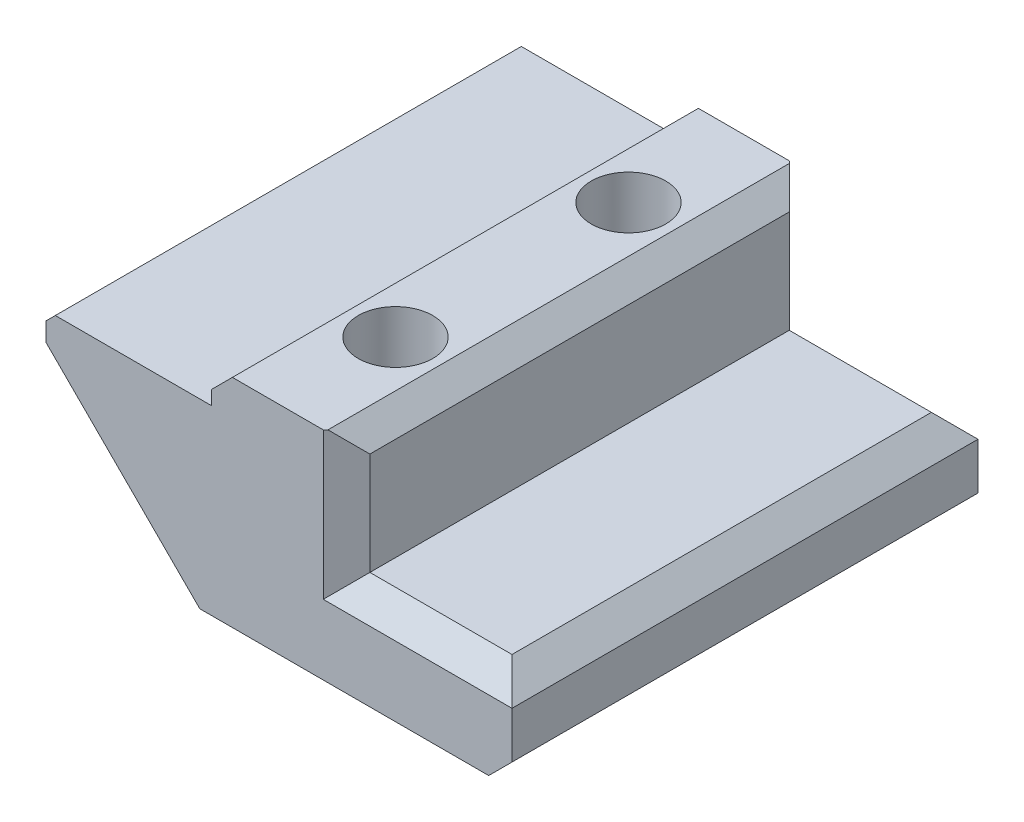
ISO-10303-21;
HEADER;
FILE_DESCRIPTION(('STEP AP214'),'2;1');
FILE_NAME('part.step','',(''),(''),'','','');
FILE_SCHEMA(('AUTOMOTIVE_DESIGN { 1 0 10303 214 1 1 1 1 }'));
ENDSEC;
DATA;
#1=APPLICATION_CONTEXT('core data for automotive mechanical design processes');
#2=APPLICATION_PROTOCOL_DEFINITION('international standard','automotive_design',2000,#1);
#3=PRODUCT_CONTEXT('',#1,'mechanical');
#4=PRODUCT('Part','Part','',(#3));
#5=PRODUCT_RELATED_PRODUCT_CATEGORY('part','',(#4));
#6=PRODUCT_DEFINITION_FORMATION('','',#4);
#7=PRODUCT_DEFINITION_CONTEXT('part definition',#1,'design');
#8=PRODUCT_DEFINITION('design','',#6,#7);
#9=PRODUCT_DEFINITION_SHAPE('','',#8);
#10=(LENGTH_UNIT() NAMED_UNIT(*) SI_UNIT(.MILLI.,.METRE.));
#11=(NAMED_UNIT(*) PLANE_ANGLE_UNIT() SI_UNIT($,.RADIAN.));
#12=(NAMED_UNIT(*) SI_UNIT($,.STERADIAN.) SOLID_ANGLE_UNIT());
#13=UNCERTAINTY_MEASURE_WITH_UNIT(LENGTH_MEASURE(1.E-05),#10,'distance_accuracy_value','');
#14=(GEOMETRIC_REPRESENTATION_CONTEXT(3) GLOBAL_UNCERTAINTY_ASSIGNED_CONTEXT((#13)) GLOBAL_UNIT_ASSIGNED_CONTEXT((#10,
#11,#12)) REPRESENTATION_CONTEXT('',''));
#15=CARTESIAN_POINT('',(0.,0.,0.));
#16=DIRECTION('',(0.,0.,1.));
#17=DIRECTION('',(1.,0.,0.));
#18=AXIS2_PLACEMENT_3D('',#15,#16,#17);
#19=CARTESIAN_POINT('',(10.,7.8,-15.));
#20=DIRECTION('',(0.,-1.,0.));
#21=DIRECTION('',(0.,0.,-1.));
#22=AXIS2_PLACEMENT_3D('',#19,#20,#21);
#23=CYLINDRICAL_SURFACE('',#22,1.6);
#24=CARTESIAN_POINT('',(10.,3.90000000000001,-15.));
#25=DIRECTION('',(0.,-1.,0.));
#26=DIRECTION('',(0.,0.,-1.));
#27=AXIS2_PLACEMENT_3D('',#24,#25,#26);
#28=CIRCLE('',#27,1.6);
#29=CARTESIAN_POINT('',(10.,3.90000000000001,-16.6));
#30=VERTEX_POINT('',#29);
#31=EDGE_CURVE('E198',#30,#30,#28,.T.);
#32=ORIENTED_EDGE('',*,*,#31,.T.);
#33=EDGE_LOOP('',(#32));
#34=FACE_BOUND('',#33,.T.);
#35=CARTESIAN_POINT('',(10.,9.3,-15.));
#36=DIRECTION('',(0.,1.,0.));
#37=DIRECTION('',(0.,0.,1.));
#38=AXIS2_PLACEMENT_3D('',#35,#36,#37);
#39=CIRCLE('',#38,1.6);
#40=CARTESIAN_POINT('',(10.,9.3,-13.4));
#41=VERTEX_POINT('',#40);
#42=EDGE_CURVE('E170',#41,#41,#39,.T.);
#43=ORIENTED_EDGE('',*,*,#42,.T.);
#44=EDGE_LOOP('',(#43));
#45=FACE_BOUND('',#44,.T.);
#46=ADVANCED_FACE('F39',(#34,#45),#23,.F.);
#47=CARTESIAN_POINT('',(10.,7.8,-5.));
#48=DIRECTION('',(0.,-1.,0.));
#49=DIRECTION('',(0.,0.,-1.));
#50=AXIS2_PLACEMENT_3D('',#47,#48,#49);
#51=CYLINDRICAL_SURFACE('',#50,1.6);
#52=CARTESIAN_POINT('',(10.,3.90000000000001,-5.));
#53=DIRECTION('',(0.,-1.,0.));
#54=DIRECTION('',(0.,0.,-1.));
#55=AXIS2_PLACEMENT_3D('',#52,#53,#54);
#56=CIRCLE('',#55,1.6);
#57=CARTESIAN_POINT('',(10.,3.90000000000001,-6.6));
#58=VERTEX_POINT('',#57);
#59=EDGE_CURVE('E201',#58,#58,#56,.T.);
#60=ORIENTED_EDGE('',*,*,#59,.T.);
#61=EDGE_LOOP('',(#60));
#62=FACE_BOUND('',#61,.T.);
#63=CARTESIAN_POINT('',(10.,9.3,-5.));
#64=DIRECTION('',(0.,1.,0.));
#65=DIRECTION('',(0.,0.,1.));
#66=AXIS2_PLACEMENT_3D('',#63,#64,#65);
#67=CIRCLE('',#66,1.6);
#68=CARTESIAN_POINT('',(10.,9.3,-3.4));
#69=VERTEX_POINT('',#68);
#70=EDGE_CURVE('E175',#69,#69,#67,.T.);
#71=ORIENTED_EDGE('',*,*,#70,.T.);
#72=EDGE_LOOP('',(#71));
#73=FACE_BOUND('',#72,.T.);
#74=ADVANCED_FACE('F342',(#62,#73),#51,.F.);
#75=CARTESIAN_POINT('',(0.,4.,0.));
#76=DIRECTION('',(0.,-1.,0.));
#77=DIRECTION('',(0.,0.,-1.));
#78=AXIS2_PLACEMENT_3D('',#75,#76,#77);
#79=PLANE('',#78);
#80=DIRECTION('',(0.,0.,-1.));
#81=VECTOR('',#80,1.);
#82=CARTESIAN_POINT('',(12.9,4.,-20.));
#83=LINE('',#82,#81);
#84=CARTESIAN_POINT('',(12.9,4.,-1.));
#85=VERTEX_POINT('',#84);
#86=CARTESIAN_POINT('',(12.9,4.,-19.));
#87=VERTEX_POINT('',#86);
#88=EDGE_CURVE('E154',#85,#87,#83,.T.);
#89=ORIENTED_EDGE('',*,*,#88,.F.);
#90=DIRECTION('',(1.,0.,0.));
#91=VECTOR('',#90,1.);
#92=CARTESIAN_POINT('',(0.,4.,-1.));
#93=LINE('',#92,#91);
#94=CARTESIAN_POINT('',(19.,4.,-1.));
#95=VERTEX_POINT('',#94);
#96=EDGE_CURVE('E249',#85,#95,#93,.T.);
#97=ORIENTED_EDGE('',*,*,#96,.T.);
#98=DIRECTION('',(0.,0.,-1.));
#99=VECTOR('',#98,1.);
#100=CARTESIAN_POINT('',(19.,4.,0.));
#101=LINE('',#100,#99);
#102=CARTESIAN_POINT('',(19.,4.,-19.));
#103=VERTEX_POINT('',#102);
#104=EDGE_CURVE('E245',#95,#103,#101,.T.);
#105=ORIENTED_EDGE('',*,*,#104,.T.);
#106=DIRECTION('',(-1.,0.,0.));
#107=VECTOR('',#106,1.);
#108=CARTESIAN_POINT('',(0.,4.,-19.));
#109=LINE('',#108,#107);
#110=EDGE_CURVE('E247',#103,#87,#109,.T.);
#111=ORIENTED_EDGE('',*,*,#110,.T.);
#112=EDGE_LOOP('',(#89,#97,#105,#111));
#113=FACE_BOUND('',#112,.T.);
#114=ADVANCED_FACE('F313',(#113),#79,.F.);
#115=CARTESIAN_POINT('',(0.,4.,0.));
#116=DIRECTION('',(1.,0.,0.));
#117=DIRECTION('',(0.,0.,-1.));
#118=AXIS2_PLACEMENT_3D('',#115,#116,#117);
#119=PLANE('',#118);
#120=DIRECTION('',(0.,-1.,0.));
#121=VECTOR('',#120,1.);
#122=CARTESIAN_POINT('',(0.,4.,0.));
#123=LINE('',#122,#121);
#124=CARTESIAN_POINT('',(0.,7.4,0.));
#125=VERTEX_POINT('',#124);
#126=CARTESIAN_POINT('',(0.,6.6,0.));
#127=VERTEX_POINT('',#126);
#128=EDGE_CURVE('E196',#125,#127,#123,.T.);
#129=ORIENTED_EDGE('',*,*,#128,.F.);
#130=DIRECTION('',(0.,0.,-1.));
#131=VECTOR('',#130,1.);
#132=CARTESIAN_POINT('',(0.,7.4,-20.));
#133=LINE('',#132,#131);
#134=CARTESIAN_POINT('',(0.,7.4,-20.));
#135=VERTEX_POINT('',#134);
#136=EDGE_CURVE('E273',#125,#135,#133,.T.);
#137=ORIENTED_EDGE('',*,*,#136,.T.);
#138=DIRECTION('',(0.,-1.,0.));
#139=VECTOR('',#138,1.);
#140=CARTESIAN_POINT('',(0.,4.,-20.));
#141=LINE('',#140,#139);
#142=CARTESIAN_POINT('',(0.,6.6,-20.));
#143=VERTEX_POINT('',#142);
#144=EDGE_CURVE('E188',#135,#143,#141,.T.);
#145=ORIENTED_EDGE('',*,*,#144,.T.);
#146=DIRECTION('',(0.,0.,1.));
#147=VECTOR('',#146,1.);
#148=CARTESIAN_POINT('',(0.,6.6,0.));
#149=LINE('',#148,#147);
#150=EDGE_CURVE('E210',#143,#127,#149,.T.);
#151=ORIENTED_EDGE('',*,*,#150,.T.);
#152=EDGE_LOOP('',(#129,#137,#145,#151));
#153=FACE_BOUND('',#152,.T.);
#154=ADVANCED_FACE('F360',(#153),#119,.F.);
#155=CARTESIAN_POINT('',(0.,4.,0.));
#156=DIRECTION('',(0.,0.,-1.));
#157=DIRECTION('',(-1.,0.,0.));
#158=AXIS2_PLACEMENT_3D('',#155,#156,#157);
#159=PLANE('',#158);
#160=DIRECTION('',(1.,0.,0.));
#161=VECTOR('',#160,1.);
#162=CARTESIAN_POINT('',(7.1,9.3,0.));
#163=LINE('',#162,#161);
#164=CARTESIAN_POINT('',(8.,9.3,0.));
#165=VERTEX_POINT('',#164);
#166=CARTESIAN_POINT('',(11.9,9.3,0.));
#167=VERTEX_POINT('',#166);
#168=EDGE_CURVE('E169',#165,#167,#163,.T.);
#169=ORIENTED_EDGE('',*,*,#168,.F.);
#170=DIRECTION('',(-0.707106781186546,-0.707106781186549,0.));
#171=VECTOR('',#170,1.);
#172=CARTESIAN_POINT('',(8.,9.3,0.));
#173=LINE('',#172,#171);
#174=CARTESIAN_POINT('',(7.1,8.4,0.));
#175=VERTEX_POINT('',#174);
#176=EDGE_CURVE('E62',#165,#175,#173,.T.);
#177=ORIENTED_EDGE('',*,*,#176,.T.);
#178=DIRECTION('',(0.,-1.,0.));
#179=VECTOR('',#178,1.);
#180=CARTESIAN_POINT('',(7.1,9.3,0.));
#181=LINE('',#180,#179);
#182=CARTESIAN_POINT('',(7.1,7.8,0.));
#183=VERTEX_POINT('',#182);
#184=EDGE_CURVE('E149',#175,#183,#181,.T.);
#185=ORIENTED_EDGE('',*,*,#184,.T.);
#186=DIRECTION('',(1.,0.,0.));
#187=VECTOR('',#186,1.);
#188=CARTESIAN_POINT('',(0.,7.8,0.));
#189=LINE('',#188,#187);
#190=CARTESIAN_POINT('',(0.400000000000001,7.8,0.));
#191=VERTEX_POINT('',#190);
#192=EDGE_CURVE('E152',#191,#183,#189,.T.);
#193=ORIENTED_EDGE('',*,*,#192,.F.);
#194=DIRECTION('',(-0.707106781186548,-0.707106781186548,0.));
#195=VECTOR('',#194,1.);
#196=CARTESIAN_POINT('',(0.400000000000001,7.8,0.));
#197=LINE('',#196,#195);
#198=EDGE_CURVE('E271',#191,#125,#197,.T.);
#199=ORIENTED_EDGE('',*,*,#198,.T.);
#200=ORIENTED_EDGE('',*,*,#128,.T.);
#201=DIRECTION('',(0.707106781186549,-0.707106781186546,0.));
#202=VECTOR('',#201,1.);
#203=CARTESIAN_POINT('',(0.,6.6,0.));
#204=LINE('',#203,#202);
#205=CARTESIAN_POINT('',(6.60000000000002,0.,0.));
#206=VERTEX_POINT('',#205);
#207=EDGE_CURVE('E213',#127,#206,#204,.T.);
#208=ORIENTED_EDGE('',*,*,#207,.T.);
#209=DIRECTION('',(1.,0.,0.));
#210=VECTOR('',#209,1.);
#211=CARTESIAN_POINT('',(0.,0.,0.));
#212=LINE('',#211,#210);
#213=CARTESIAN_POINT('',(19.,0.,0.));
#214=VERTEX_POINT('',#213);
#215=EDGE_CURVE('E181',#206,#214,#212,.T.);
#216=ORIENTED_EDGE('',*,*,#215,.T.);
#217=DIRECTION('',(0.707106781186549,0.707106781186546,0.));
#218=VECTOR('',#217,1.);
#219=CARTESIAN_POINT('',(20.,1.,0.));
#220=LINE('',#219,#218);
#221=CARTESIAN_POINT('',(20.,1.,0.));
#222=VERTEX_POINT('',#221);
#223=EDGE_CURVE('E238',#214,#222,#220,.T.);
#224=ORIENTED_EDGE('',*,*,#223,.T.);
#225=DIRECTION('',(0.,-1.,0.));
#226=VECTOR('',#225,1.);
#227=CARTESIAN_POINT('',(20.,4.,0.));
#228=LINE('',#227,#226);
#229=CARTESIAN_POINT('',(20.,3.,0.));
#230=VERTEX_POINT('',#229);
#231=EDGE_CURVE('E193',#230,#222,#228,.T.);
#232=ORIENTED_EDGE('',*,*,#231,.F.);
#233=DIRECTION('',(-1.,0.,0.));
#234=VECTOR('',#233,1.);
#235=CARTESIAN_POINT('',(0.,3.,0.));
#236=LINE('',#235,#234);
#237=CARTESIAN_POINT('',(11.9,3.,0.));
#238=VERTEX_POINT('',#237);
#239=EDGE_CURVE('E240',#230,#238,#236,.T.);
#240=ORIENTED_EDGE('',*,*,#239,.T.);
#241=DIRECTION('',(0.,1.,0.));
#242=VECTOR('',#241,1.);
#243=CARTESIAN_POINT('',(11.9,4.,0.));
#244=LINE('',#243,#242);
#245=EDGE_CURVE('E242',#238,#167,#244,.T.);
#246=ORIENTED_EDGE('',*,*,#245,.T.);
#247=EDGE_LOOP('',(#169,#177,#185,#193,#199,#200,#208,#216,#224,#232,#240,#246));
#248=FACE_BOUND('',#247,.T.);
#249=ADVANCED_FACE('F151',(#248),#159,.F.);
#250=CARTESIAN_POINT('',(20.,4.,0.));
#251=DIRECTION('',(-1.,0.,0.));
#252=DIRECTION('',(0.,0.,1.));
#253=AXIS2_PLACEMENT_3D('',#250,#251,#252);
#254=PLANE('',#253);
#255=DIRECTION('',(0.,-1.,0.));
#256=VECTOR('',#255,1.);
#257=CARTESIAN_POINT('',(20.,4.,-20.));
#258=LINE('',#257,#256);
#259=CARTESIAN_POINT('',(20.,3.,-20.));
#260=VERTEX_POINT('',#259);
#261=CARTESIAN_POINT('',(20.,1.,-20.));
#262=VERTEX_POINT('',#261);
#263=EDGE_CURVE('E190',#260,#262,#258,.T.);
#264=ORIENTED_EDGE('',*,*,#263,.F.);
#265=DIRECTION('',(0.,0.,1.));
#266=VECTOR('',#265,1.);
#267=CARTESIAN_POINT('',(20.,3.,0.));
#268=LINE('',#267,#266);
#269=EDGE_CURVE('E254',#260,#230,#268,.T.);
#270=ORIENTED_EDGE('',*,*,#269,.T.);
#271=ORIENTED_EDGE('',*,*,#231,.T.);
#272=DIRECTION('',(0.,0.,-1.));
#273=VECTOR('',#272,1.);
#274=CARTESIAN_POINT('',(20.,1.,-20.));
#275=LINE('',#274,#273);
#276=EDGE_CURVE('E251',#222,#262,#275,.T.);
#277=ORIENTED_EDGE('',*,*,#276,.T.);
#278=EDGE_LOOP('',(#264,#270,#271,#277));
#279=FACE_BOUND('',#278,.T.);
#280=ADVANCED_FACE('F366',(#279),#254,.F.);
#281=CARTESIAN_POINT('',(0.,4.,-20.));
#282=DIRECTION('',(0.,0.,1.));
#283=DIRECTION('',(1.,0.,0.));
#284=AXIS2_PLACEMENT_3D('',#281,#282,#283);
#285=PLANE('',#284);
#286=DIRECTION('',(0.,-1.,0.));
#287=VECTOR('',#286,1.);
#288=CARTESIAN_POINT('',(7.1,9.3,-20.));
#289=LINE('',#288,#287);
#290=CARTESIAN_POINT('',(7.1,8.4,-20.));
#291=VERTEX_POINT('',#290);
#292=CARTESIAN_POINT('',(7.1,7.8,-20.));
#293=VERTEX_POINT('',#292);
#294=EDGE_CURVE('E155',#291,#293,#289,.T.);
#295=ORIENTED_EDGE('',*,*,#294,.F.);
#296=DIRECTION('',(0.707106781186546,0.707106781186549,0.));
#297=VECTOR('',#296,1.);
#298=CARTESIAN_POINT('',(8.,9.3,-20.));
#299=LINE('',#298,#297);
#300=CARTESIAN_POINT('',(8.,9.3,-20.));
#301=VERTEX_POINT('',#300);
#302=EDGE_CURVE('E11',#291,#301,#299,.T.);
#303=ORIENTED_EDGE('',*,*,#302,.T.);
#304=DIRECTION('',(-1.,0.,0.));
#305=VECTOR('',#304,1.);
#306=CARTESIAN_POINT('',(7.1,9.3,-20.));
#307=LINE('',#306,#305);
#308=CARTESIAN_POINT('',(11.9,9.3,-20.));
#309=VERTEX_POINT('',#308);
#310=EDGE_CURVE('E172',#309,#301,#307,.T.);
#311=ORIENTED_EDGE('',*,*,#310,.F.);
#312=DIRECTION('',(0.,-1.,0.));
#313=VECTOR('',#312,1.);
#314=CARTESIAN_POINT('',(11.9,4.,-20.));
#315=LINE('',#314,#313);
#316=CARTESIAN_POINT('',(11.9,3.,-20.));
#317=VERTEX_POINT('',#316);
#318=EDGE_CURVE('E225',#309,#317,#315,.T.);
#319=ORIENTED_EDGE('',*,*,#318,.T.);
#320=DIRECTION('',(1.,0.,0.));
#321=VECTOR('',#320,1.);
#322=CARTESIAN_POINT('',(0.,3.,-20.));
#323=LINE('',#322,#321);
#324=EDGE_CURVE('E223',#317,#260,#323,.T.);
#325=ORIENTED_EDGE('',*,*,#324,.T.);
#326=ORIENTED_EDGE('',*,*,#263,.T.);
#327=DIRECTION('',(-0.707106781186549,-0.707106781186546,0.));
#328=VECTOR('',#327,1.);
#329=CARTESIAN_POINT('',(20.,1.,-20.));
#330=LINE('',#329,#328);
#331=CARTESIAN_POINT('',(19.,0.,-20.));
#332=VERTEX_POINT('',#331);
#333=EDGE_CURVE('E221',#262,#332,#330,.T.);
#334=ORIENTED_EDGE('',*,*,#333,.T.);
#335=DIRECTION('',(-1.,0.,0.));
#336=VECTOR('',#335,1.);
#337=CARTESIAN_POINT('',(0.,0.,-20.));
#338=LINE('',#337,#336);
#339=CARTESIAN_POINT('',(6.60000000000002,0.,-20.));
#340=VERTEX_POINT('',#339);
#341=EDGE_CURVE('E186',#332,#340,#338,.T.);
#342=ORIENTED_EDGE('',*,*,#341,.T.);
#343=DIRECTION('',(-0.707106781186549,0.707106781186546,0.));
#344=VECTOR('',#343,1.);
#345=CARTESIAN_POINT('',(0.,6.6,-20.));
#346=LINE('',#345,#344);
#347=EDGE_CURVE('E218',#340,#143,#346,.T.);
#348=ORIENTED_EDGE('',*,*,#347,.T.);
#349=ORIENTED_EDGE('',*,*,#144,.F.);
#350=DIRECTION('',(0.707106781186548,0.707106781186548,0.));
#351=VECTOR('',#350,1.);
#352=CARTESIAN_POINT('',(0.400000000000001,7.8,-20.));
#353=LINE('',#352,#351);
#354=CARTESIAN_POINT('',(0.400000000000001,7.8,-20.));
#355=VERTEX_POINT('',#354);
#356=EDGE_CURVE('E275',#135,#355,#353,.T.);
#357=ORIENTED_EDGE('',*,*,#356,.T.);
#358=DIRECTION('',(-1.,0.,0.));
#359=VECTOR('',#358,1.);
#360=CARTESIAN_POINT('',(0.,7.8,-20.));
#361=LINE('',#360,#359);
#362=EDGE_CURVE('E166',#293,#355,#361,.T.);
#363=ORIENTED_EDGE('',*,*,#362,.F.);
#364=EDGE_LOOP('',(#295,#303,#311,#319,#325,#326,#334,#342,#348,#349,#357,#363));
#365=FACE_BOUND('',#364,.T.);
#366=ADVANCED_FACE('F330',(#365),#285,.F.);
#367=CARTESIAN_POINT('',(0.,0.,0.));
#368=DIRECTION('',(0.,-1.,0.));
#369=DIRECTION('',(0.,0.,-1.));
#370=AXIS2_PLACEMENT_3D('',#367,#368,#369);
#371=PLANE('',#370);
#372=CARTESIAN_POINT('',(10.,0.,-5.));
#373=DIRECTION('',(0.,-1.,0.));
#374=DIRECTION('',(0.,0.,-1.));
#375=AXIS2_PLACEMENT_3D('',#372,#373,#374);
#376=CIRCLE('',#375,3.);
#377=CARTESIAN_POINT('',(10.,0.,-8.));
#378=VERTEX_POINT('',#377);
#379=EDGE_CURVE('E645',#378,#378,#376,.T.);
#380=ORIENTED_EDGE('',*,*,#379,.F.);
#381=EDGE_LOOP('',(#380));
#382=FACE_BOUND('',#381,.T.);
#383=CARTESIAN_POINT('',(10.,0.,-15.));
#384=DIRECTION('',(0.,-1.,0.));
#385=DIRECTION('',(0.,0.,-1.));
#386=AXIS2_PLACEMENT_3D('',#383,#384,#385);
#387=CIRCLE('',#386,3.);
#388=CARTESIAN_POINT('',(10.,0.,-18.));
#389=VERTEX_POINT('',#388);
#390=EDGE_CURVE('E269',#389,#389,#387,.T.);
#391=ORIENTED_EDGE('',*,*,#390,.F.);
#392=EDGE_LOOP('',(#391));
#393=FACE_BOUND('',#392,.T.);
#394=ORIENTED_EDGE('',*,*,#341,.F.);
#395=DIRECTION('',(0.,0.,1.));
#396=VECTOR('',#395,1.);
#397=CARTESIAN_POINT('',(19.,0.,0.));
#398=LINE('',#397,#396);
#399=EDGE_CURVE('E256',#332,#214,#398,.T.);
#400=ORIENTED_EDGE('',*,*,#399,.T.);
#401=ORIENTED_EDGE('',*,*,#215,.F.);
#402=DIRECTION('',(0.,0.,-1.));
#403=VECTOR('',#402,1.);
#404=CARTESIAN_POINT('',(6.60000000000002,0.,-20.));
#405=LINE('',#404,#403);
#406=EDGE_CURVE('E215',#206,#340,#405,.T.);
#407=ORIENTED_EDGE('',*,*,#406,.T.);
#408=EDGE_LOOP('',(#394,#400,#401,#407));
#409=FACE_BOUND('',#408,.T.);
#410=ADVANCED_FACE('F357',(#382,#393,#409),#371,.T.);
#411=CARTESIAN_POINT('',(12.9,7.8,-20.));
#412=DIRECTION('',(-1.,0.,0.));
#413=DIRECTION('',(0.,0.,1.));
#414=AXIS2_PLACEMENT_3D('',#411,#412,#413);
#415=PLANE('',#414);
#416=DIRECTION('',(0.,1.,0.));
#417=VECTOR('',#416,1.);
#418=CARTESIAN_POINT('',(12.9,7.8,-19.));
#419=LINE('',#418,#417);
#420=CARTESIAN_POINT('',(12.9,8.4,-19.));
#421=VERTEX_POINT('',#420);
#422=EDGE_CURVE('E230',#87,#421,#419,.T.);
#423=ORIENTED_EDGE('',*,*,#422,.T.);
#424=DIRECTION('',(0.,0.,1.));
#425=VECTOR('',#424,1.);
#426=CARTESIAN_POINT('',(12.9,8.4,-1.));
#427=LINE('',#426,#425);
#428=CARTESIAN_POINT('',(12.9,8.4,-1.));
#429=VERTEX_POINT('',#428);
#430=EDGE_CURVE('E285',#421,#429,#427,.T.);
#431=ORIENTED_EDGE('',*,*,#430,.T.);
#432=DIRECTION('',(0.,-1.,0.));
#433=VECTOR('',#432,1.);
#434=CARTESIAN_POINT('',(12.9,7.8,-1.));
#435=LINE('',#434,#433);
#436=EDGE_CURVE('E228',#429,#85,#435,.T.);
#437=ORIENTED_EDGE('',*,*,#436,.T.);
#438=ORIENTED_EDGE('',*,*,#88,.T.);
#439=EDGE_LOOP('',(#423,#431,#437,#438));
#440=FACE_BOUND('',#439,.T.);
#441=ADVANCED_FACE('F310',(#440),#415,.F.);
#442=CARTESIAN_POINT('',(0.,7.8,0.));
#443=DIRECTION('',(0.,1.,0.));
#444=DIRECTION('',(0.,0.,1.));
#445=AXIS2_PLACEMENT_3D('',#442,#443,#444);
#446=PLANE('',#445);
#447=ORIENTED_EDGE('',*,*,#362,.T.);
#448=DIRECTION('',(0.,0.,1.));
#449=VECTOR('',#448,1.);
#450=CARTESIAN_POINT('',(0.400000000000001,7.8,0.));
#451=LINE('',#450,#449);
#452=EDGE_CURVE('E165',#355,#191,#451,.T.);
#453=ORIENTED_EDGE('',*,*,#452,.T.);
#454=ORIENTED_EDGE('',*,*,#192,.T.);
#455=DIRECTION('',(0.,0.,1.));
#456=VECTOR('',#455,1.);
#457=CARTESIAN_POINT('',(7.1,7.8,-20.));
#458=LINE('',#457,#456);
#459=EDGE_CURVE('E162',#293,#183,#458,.T.);
#460=ORIENTED_EDGE('',*,*,#459,.F.);
#461=EDGE_LOOP('',(#447,#453,#454,#460));
#462=FACE_BOUND('',#461,.T.);
#463=ADVANCED_FACE('F161',(#462),#446,.T.);
#464=CARTESIAN_POINT('',(0.,9.3,0.));
#465=DIRECTION('',(0.,1.,0.));
#466=DIRECTION('',(0.,0.,1.));
#467=AXIS2_PLACEMENT_3D('',#464,#465,#466);
#468=PLANE('',#467);
#469=ORIENTED_EDGE('',*,*,#42,.F.);
#470=EDGE_LOOP('',(#469));
#471=FACE_BOUND('',#470,.T.);
#472=DIRECTION('',(-0.707106781186549,0.,0.707106781186546));
#473=VECTOR('',#472,1.);
#474=CARTESIAN_POINT('',(5.94999999999998,9.3,5.95));
#475=LINE('',#474,#473);
#476=CARTESIAN_POINT('',(12.,9.3,-0.100000000000006));
#477=VERTEX_POINT('',#476);
#478=EDGE_CURVE('E233',#167,#477,#475,.F.);
#479=ORIENTED_EDGE('',*,*,#478,.T.);
#480=DIRECTION('',(0.,0.,-1.));
#481=VECTOR('',#480,1.);
#482=CARTESIAN_POINT('',(12.,9.3,-19.));
#483=LINE('',#482,#481);
#484=CARTESIAN_POINT('',(12.,9.3,-19.9));
#485=VERTEX_POINT('',#484);
#486=EDGE_CURVE('E280',#477,#485,#483,.T.);
#487=ORIENTED_EDGE('',*,*,#486,.T.);
#488=DIRECTION('',(0.707106781186546,0.,0.707106781186549));
#489=VECTOR('',#488,1.);
#490=CARTESIAN_POINT('',(15.95,9.3,-15.95));
#491=LINE('',#490,#489);
#492=EDGE_CURVE('E236',#485,#309,#491,.F.);
#493=ORIENTED_EDGE('',*,*,#492,.T.);
#494=ORIENTED_EDGE('',*,*,#310,.T.);
#495=DIRECTION('',(0.,0.,1.));
#496=VECTOR('',#495,1.);
#497=CARTESIAN_POINT('',(8.,9.3,0.));
#498=LINE('',#497,#496);
#499=EDGE_CURVE('E277',#301,#165,#498,.T.);
#500=ORIENTED_EDGE('',*,*,#499,.T.);
#501=ORIENTED_EDGE('',*,*,#168,.T.);
#502=EDGE_LOOP('',(#479,#487,#493,#494,#500,#501));
#503=FACE_BOUND('',#502,.T.);
#504=ORIENTED_EDGE('',*,*,#70,.F.);
#505=EDGE_LOOP('',(#504));
#506=FACE_BOUND('',#505,.T.);
#507=ADVANCED_FACE('F300',(#471,#503,#506),#468,.T.);
#508=CARTESIAN_POINT('',(7.1,9.3,-20.));
#509=DIRECTION('',(1.,0.,0.));
#510=DIRECTION('',(0.,0.,-1.));
#511=AXIS2_PLACEMENT_3D('',#508,#509,#510);
#512=PLANE('',#511);
#513=ORIENTED_EDGE('',*,*,#184,.F.);
#514=DIRECTION('',(0.,0.,-1.));
#515=VECTOR('',#514,1.);
#516=CARTESIAN_POINT('',(7.1,8.4,-20.));
#517=LINE('',#516,#515);
#518=EDGE_CURVE('E48',#175,#291,#517,.T.);
#519=ORIENTED_EDGE('',*,*,#518,.T.);
#520=ORIENTED_EDGE('',*,*,#294,.T.);
#521=ORIENTED_EDGE('',*,*,#459,.T.);
#522=EDGE_LOOP('',(#513,#519,#520,#521));
#523=FACE_BOUND('',#522,.T.);
#524=ADVANCED_FACE('F168',(#523),#512,.F.);
#525=CARTESIAN_POINT('',(10.,2.4,-5.));
#526=DIRECTION('',(0.,-1.,0.));
#527=DIRECTION('',(0.,0.,-1.));
#528=AXIS2_PLACEMENT_3D('',#525,#526,#527);
#529=CYLINDRICAL_SURFACE('',#528,3.);
#530=CARTESIAN_POINT('',(10.,2.50000000000002,-5.));
#531=DIRECTION('',(0.,-1.,0.));
#532=DIRECTION('',(0.,0.,-1.));
#533=AXIS2_PLACEMENT_3D('',#530,#531,#532);
#534=CIRCLE('',#533,3.);
#535=CARTESIAN_POINT('',(10.,2.50000000000002,-8.));
#536=VERTEX_POINT('',#535);
#537=EDGE_CURVE('E207',#536,#536,#534,.F.);
#538=ORIENTED_EDGE('',*,*,#537,.T.);
#539=EDGE_LOOP('',(#538));
#540=FACE_BOUND('',#539,.T.);
#541=ORIENTED_EDGE('',*,*,#379,.T.);
#542=EDGE_LOOP('',(#541));
#543=FACE_BOUND('',#542,.T.);
#544=ADVANCED_FACE('F493',(#540,#543),#529,.F.);
#545=CARTESIAN_POINT('',(10.,2.4,-15.));
#546=DIRECTION('',(0.,-1.,0.));
#547=DIRECTION('',(0.,0.,-1.));
#548=AXIS2_PLACEMENT_3D('',#545,#546,#547);
#549=CYLINDRICAL_SURFACE('',#548,3.);
#550=CARTESIAN_POINT('',(10.,2.50000000000002,-15.));
#551=DIRECTION('',(0.,-1.,0.));
#552=DIRECTION('',(0.,0.,-1.));
#553=AXIS2_PLACEMENT_3D('',#550,#551,#552);
#554=CIRCLE('',#553,3.);
#555=CARTESIAN_POINT('',(10.,2.50000000000002,-18.));
#556=VERTEX_POINT('',#555);
#557=EDGE_CURVE('E204',#556,#556,#554,.F.);
#558=ORIENTED_EDGE('',*,*,#557,.T.);
#559=EDGE_LOOP('',(#558));
#560=FACE_BOUND('',#559,.T.);
#561=ORIENTED_EDGE('',*,*,#390,.T.);
#562=EDGE_LOOP('',(#561));
#563=FACE_BOUND('',#562,.T.);
#564=ADVANCED_FACE('F383',(#560,#563),#549,.F.);
#565=CARTESIAN_POINT('',(10.,2.4,-15.));
#566=DIRECTION('',(0.,-1.,0.));
#567=DIRECTION('',(0.,0.,-1.));
#568=AXIS2_PLACEMENT_3D('',#565,#566,#567);
#569=CONICAL_SURFACE('',#568,3.10000000000003,0.785398163397453);
#570=ORIENTED_EDGE('',*,*,#31,.F.);
#571=EDGE_LOOP('',(#570));
#572=FACE_BOUND('',#571,.T.);
#573=ORIENTED_EDGE('',*,*,#557,.F.);
#574=EDGE_LOOP('',(#573));
#575=FACE_BOUND('',#574,.T.);
#576=ADVANCED_FACE('F376',(#572,#575),#569,.F.);
#577=CARTESIAN_POINT('',(10.,2.4,-5.));
#578=DIRECTION('',(0.,-1.,0.));
#579=DIRECTION('',(0.,0.,-1.));
#580=AXIS2_PLACEMENT_3D('',#577,#578,#579);
#581=CONICAL_SURFACE('',#580,3.10000000000003,0.785398163397453);
#582=ORIENTED_EDGE('',*,*,#59,.F.);
#583=EDGE_LOOP('',(#582));
#584=FACE_BOUND('',#583,.T.);
#585=ORIENTED_EDGE('',*,*,#537,.F.);
#586=EDGE_LOOP('',(#585));
#587=FACE_BOUND('',#586,.T.);
#588=ADVANCED_FACE('F382',(#584,#587),#581,.F.);
#589=CARTESIAN_POINT('',(0.,6.6,0.));
#590=DIRECTION('',(-0.707106781186546,-0.707106781186549,0.));
#591=DIRECTION('',(0.,0.,-1.));
#592=AXIS2_PLACEMENT_3D('',#589,#590,#591);
#593=PLANE('',#592);
#594=ORIENTED_EDGE('',*,*,#347,.F.);
#595=ORIENTED_EDGE('',*,*,#406,.F.);
#596=ORIENTED_EDGE('',*,*,#207,.F.);
#597=ORIENTED_EDGE('',*,*,#150,.F.);
#598=EDGE_LOOP('',(#594,#595,#596,#597));
#599=FACE_BOUND('',#598,.T.);
#600=ADVANCED_FACE('F390',(#599),#593,.T.);
#601=CARTESIAN_POINT('',(12.9,7.8,-1.));
#602=DIRECTION('',(-0.707106781186546,0.,-0.707106781186549));
#603=DIRECTION('',(0.,-1.,0.));
#604=AXIS2_PLACEMENT_3D('',#601,#602,#603);
#605=PLANE('',#604);
#606=ORIENTED_EDGE('',*,*,#436,.F.);
#607=DIRECTION('',(0.577350269189625,-0.577350269189629,-0.577350269189623));
#608=VECTOR('',#607,1.);
#609=CARTESIAN_POINT('',(13.1,8.2,-1.2));
#610=LINE('',#609,#608);
#611=EDGE_CURVE('E287',#429,#477,#610,.F.);
#612=ORIENTED_EDGE('',*,*,#611,.T.);
#613=ORIENTED_EDGE('',*,*,#478,.F.);
#614=ORIENTED_EDGE('',*,*,#245,.F.);
#615=DIRECTION('',(-0.577350269189626,-0.577350269189626,0.577350269189624));
#616=VECTOR('',#615,1.);
#617=CARTESIAN_POINT('',(14.1666666666667,5.26666666666667,-2.26666666666667));
#618=LINE('',#617,#616);
#619=EDGE_CURVE('E266',#85,#238,#618,.T.);
#620=ORIENTED_EDGE('',*,*,#619,.F.);
#621=EDGE_LOOP('',(#606,#612,#613,#614,#620));
#622=FACE_BOUND('',#621,.T.);
#623=ADVANCED_FACE('F293',(#622),#605,.F.);
#624=CARTESIAN_POINT('',(0.,4.,-1.));
#625=DIRECTION('',(0.,-0.707106781186546,-0.707106781186549));
#626=DIRECTION('',(1.,0.,0.));
#627=AXIS2_PLACEMENT_3D('',#624,#625,#626);
#628=PLANE('',#627);
#629=ORIENTED_EDGE('',*,*,#619,.T.);
#630=ORIENTED_EDGE('',*,*,#239,.F.);
#631=DIRECTION('',(0.577350269189625,-0.577350269189627,0.577350269189625));
#632=VECTOR('',#631,1.);
#633=CARTESIAN_POINT('',(19.3333333333333,3.66666666666667,-0.666666666666668));
#634=LINE('',#633,#632);
#635=EDGE_CURVE('E263',#95,#230,#634,.T.);
#636=ORIENTED_EDGE('',*,*,#635,.F.);
#637=ORIENTED_EDGE('',*,*,#96,.F.);
#638=EDGE_LOOP('',(#629,#630,#636,#637));
#639=FACE_BOUND('',#638,.T.);
#640=ADVANCED_FACE('F319',(#639),#628,.F.);
#641=CARTESIAN_POINT('',(19.,4.,0.));
#642=DIRECTION('',(-0.707106781186549,-0.707106781186546,0.));
#643=DIRECTION('',(0.,0.,-1.));
#644=AXIS2_PLACEMENT_3D('',#641,#642,#643);
#645=PLANE('',#644);
#646=ORIENTED_EDGE('',*,*,#635,.T.);
#647=ORIENTED_EDGE('',*,*,#269,.F.);
#648=DIRECTION('',(-0.577350269189625,0.577350269189627,0.577350269189625));
#649=VECTOR('',#648,1.);
#650=CARTESIAN_POINT('',(12.6666666666667,10.3333333333333,-12.6666666666667));
#651=LINE('',#650,#649);
#652=EDGE_CURVE('E260',#103,#260,#651,.F.);
#653=ORIENTED_EDGE('',*,*,#652,.F.);
#654=ORIENTED_EDGE('',*,*,#104,.F.);
#655=EDGE_LOOP('',(#646,#647,#653,#654));
#656=FACE_BOUND('',#655,.T.);
#657=ADVANCED_FACE('F324',(#656),#645,.F.);
#658=CARTESIAN_POINT('',(0.,4.,-19.));
#659=DIRECTION('',(0.,-0.707106781186546,0.707106781186549));
#660=DIRECTION('',(-1.,0.,0.));
#661=AXIS2_PLACEMENT_3D('',#658,#659,#660);
#662=PLANE('',#661);
#663=ORIENTED_EDGE('',*,*,#652,.T.);
#664=ORIENTED_EDGE('',*,*,#324,.F.);
#665=DIRECTION('',(0.577350269189624,0.577350269189628,0.577350269189626));
#666=VECTOR('',#665,1.);
#667=CARTESIAN_POINT('',(12.2333333333333,3.33333333333333,-19.6666666666667));
#668=LINE('',#667,#666);
#669=EDGE_CURVE('E258',#87,#317,#668,.F.);
#670=ORIENTED_EDGE('',*,*,#669,.F.);
#671=ORIENTED_EDGE('',*,*,#110,.F.);
#672=EDGE_LOOP('',(#663,#664,#670,#671));
#673=FACE_BOUND('',#672,.T.);
#674=ADVANCED_FACE('F327',(#673),#662,.F.);
#675=CARTESIAN_POINT('',(11.9,4.,-20.));
#676=DIRECTION('',(-0.707106781186549,0.,0.707106781186546));
#677=DIRECTION('',(0.,-1.,0.));
#678=AXIS2_PLACEMENT_3D('',#675,#676,#677);
#679=PLANE('',#678);
#680=ORIENTED_EDGE('',*,*,#492,.F.);
#681=DIRECTION('',(-0.577350269189624,0.577350269189627,-0.577350269189626));
#682=VECTOR('',#681,1.);
#683=CARTESIAN_POINT('',(13.7,7.59999999999999,-18.2));
#684=LINE('',#683,#682);
#685=EDGE_CURVE('E283',#485,#421,#684,.F.);
#686=ORIENTED_EDGE('',*,*,#685,.T.);
#687=ORIENTED_EDGE('',*,*,#422,.F.);
#688=ORIENTED_EDGE('',*,*,#669,.T.);
#689=ORIENTED_EDGE('',*,*,#318,.F.);
#690=EDGE_LOOP('',(#680,#686,#687,#688,#689));
#691=FACE_BOUND('',#690,.T.);
#692=ADVANCED_FACE('F306',(#691),#679,.F.);
#693=CARTESIAN_POINT('',(20.,1.,0.));
#694=DIRECTION('',(0.707106781186546,-0.707106781186549,0.));
#695=DIRECTION('',(0.,0.,1.));
#696=AXIS2_PLACEMENT_3D('',#693,#694,#695);
#697=PLANE('',#696);
#698=ORIENTED_EDGE('',*,*,#223,.F.);
#699=ORIENTED_EDGE('',*,*,#399,.F.);
#700=ORIENTED_EDGE('',*,*,#333,.F.);
#701=ORIENTED_EDGE('',*,*,#276,.F.);
#702=EDGE_LOOP('',(#698,#699,#700,#701));
#703=FACE_BOUND('',#702,.T.);
#704=ADVANCED_FACE('F405',(#703),#697,.T.);
#705=CARTESIAN_POINT('',(0.400000000000001,7.8,0.));
#706=DIRECTION('',(-0.707106781186547,0.707106781186547,0.));
#707=DIRECTION('',(0.,0.,-1.));
#708=AXIS2_PLACEMENT_3D('',#705,#706,#707);
#709=PLANE('',#708);
#710=ORIENTED_EDGE('',*,*,#356,.F.);
#711=ORIENTED_EDGE('',*,*,#136,.F.);
#712=ORIENTED_EDGE('',*,*,#198,.F.);
#713=ORIENTED_EDGE('',*,*,#452,.F.);
#714=EDGE_LOOP('',(#710,#711,#712,#713));
#715=FACE_BOUND('',#714,.T.);
#716=ADVANCED_FACE('F340',(#715),#709,.T.);
#717=CARTESIAN_POINT('',(12.,9.3,0.));
#718=DIRECTION('',(0.70710678118655,0.707106781186545,0.));
#719=DIRECTION('',(0.,0.,1.));
#720=AXIS2_PLACEMENT_3D('',#717,#718,#719);
#721=PLANE('',#720);
#722=ORIENTED_EDGE('',*,*,#611,.F.);
#723=ORIENTED_EDGE('',*,*,#430,.F.);
#724=ORIENTED_EDGE('',*,*,#685,.F.);
#725=ORIENTED_EDGE('',*,*,#486,.F.);
#726=EDGE_LOOP('',(#722,#723,#724,#725));
#727=FACE_BOUND('',#726,.T.);
#728=ADVANCED_FACE('F303',(#727),#721,.T.);
#729=CARTESIAN_POINT('',(8.,9.3,0.));
#730=DIRECTION('',(-0.707106781186549,0.707106781186546,0.));
#731=DIRECTION('',(0.,0.,-1.));
#732=AXIS2_PLACEMENT_3D('',#729,#730,#731);
#733=PLANE('',#732);
#734=ORIENTED_EDGE('',*,*,#302,.F.);
#735=ORIENTED_EDGE('',*,*,#518,.F.);
#736=ORIENTED_EDGE('',*,*,#176,.F.);
#737=ORIENTED_EDGE('',*,*,#499,.F.);
#738=EDGE_LOOP('',(#734,#735,#736,#737));
#739=FACE_BOUND('',#738,.T.);
#740=ADVANCED_FACE('F42',(#739),#733,.T.);
#741=CLOSED_SHELL('',(#46,#74,#114,#154,#249,#280,#366,#410,#441,#463,#507,#524,#544,#564,#576,
#588,#600,#623,#640,#657,#674,#692,#704,#716,#728,#740));
#742=MANIFOLD_SOLID_BREP('B2',#741);
#743=ADVANCED_BREP_SHAPE_REPRESENTATION('',(#18,#742),#14);
#744=SHAPE_DEFINITION_REPRESENTATION(#9,#743);
ENDSEC;
END-ISO-10303-21;
